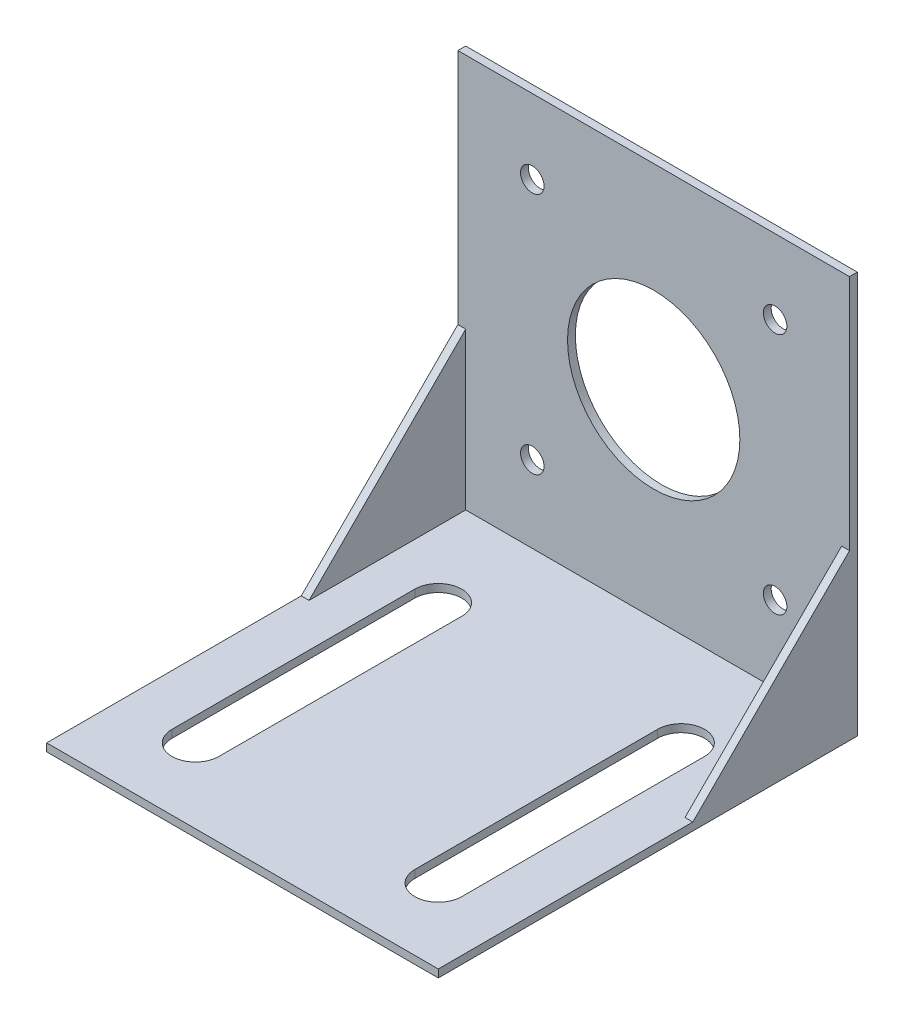
ISO-10303-21;
HEADER;
FILE_DESCRIPTION(('STEP AP214'),'2;1');
FILE_NAME('part.step','',(''),(''),'','','');
FILE_SCHEMA(('AUTOMOTIVE_DESIGN { 1 0 10303 214 1 1 1 1 }'));
ENDSEC;
DATA;
#1=APPLICATION_CONTEXT('core data for automotive mechanical design processes');
#2=APPLICATION_PROTOCOL_DEFINITION('international standard','automotive_design',2000,#1);
#3=PRODUCT_CONTEXT('',#1,'mechanical');
#4=PRODUCT('Part','Part','',(#3));
#5=PRODUCT_RELATED_PRODUCT_CATEGORY('part','',(#4));
#6=PRODUCT_DEFINITION_FORMATION('','',#4);
#7=PRODUCT_DEFINITION_CONTEXT('part definition',#1,'design');
#8=PRODUCT_DEFINITION('design','',#6,#7);
#9=PRODUCT_DEFINITION_SHAPE('','',#8);
#10=(LENGTH_UNIT() NAMED_UNIT(*) SI_UNIT(.MILLI.,.METRE.));
#11=(NAMED_UNIT(*) PLANE_ANGLE_UNIT() SI_UNIT($,.RADIAN.));
#12=(NAMED_UNIT(*) SI_UNIT($,.STERADIAN.) SOLID_ANGLE_UNIT());
#13=UNCERTAINTY_MEASURE_WITH_UNIT(LENGTH_MEASURE(1.E-05),#10,'distance_accuracy_value','');
#14=(GEOMETRIC_REPRESENTATION_CONTEXT(3) GLOBAL_UNCERTAINTY_ASSIGNED_CONTEXT((#13)) GLOBAL_UNIT_ASSIGNED_CONTEXT((#10,
#11,#12)) REPRESENTATION_CONTEXT('',''));
#15=CARTESIAN_POINT('',(0.,0.,0.));
#16=DIRECTION('',(0.,0.,1.));
#17=DIRECTION('',(1.,0.,0.));
#18=AXIS2_PLACEMENT_3D('',#15,#16,#17);
#19=CARTESIAN_POINT('',(0.,1.,0.));
#20=DIRECTION('',(0.,1.,0.));
#21=DIRECTION('',(0.,0.,1.));
#22=AXIS2_PLACEMENT_3D('',#19,#20,#21);
#23=PLANE('',#22);
#24=DIRECTION('',(0.,0.,1.));
#25=VECTOR('',#24,1.);
#26=CARTESIAN_POINT('',(-18.5,1.,-13.75));
#27=LINE('',#26,#25);
#28=CARTESIAN_POINT('',(-18.5,1.,-13.75));
#29=VERTEX_POINT('',#28);
#30=CARTESIAN_POINT('',(-18.5,1.,17.25));
#31=VERTEX_POINT('',#30);
#32=EDGE_CURVE('E226',#29,#31,#27,.T.);
#33=ORIENTED_EDGE('',*,*,#32,.F.);
#34=CARTESIAN_POINT('',(-15.5,1.,-13.75));
#35=DIRECTION('',(0.,1.,0.));
#36=DIRECTION('',(0.,0.,-1.));
#37=AXIS2_PLACEMENT_3D('',#34,#35,#36);
#38=CIRCLE('',#37,3.);
#39=CARTESIAN_POINT('',(-12.5,1.,-13.75));
#40=VERTEX_POINT('',#39);
#41=EDGE_CURVE('E224',#40,#29,#38,.T.);
#42=ORIENTED_EDGE('',*,*,#41,.F.);
#43=DIRECTION('',(0.,0.,-1.));
#44=VECTOR('',#43,1.);
#45=CARTESIAN_POINT('',(-12.5,1.,-13.75));
#46=LINE('',#45,#44);
#47=CARTESIAN_POINT('',(-12.5,1.,17.25));
#48=VERTEX_POINT('',#47);
#49=EDGE_CURVE('E232',#48,#40,#46,.T.);
#50=ORIENTED_EDGE('',*,*,#49,.F.);
#51=CARTESIAN_POINT('',(-15.5,1.,17.25));
#52=DIRECTION('',(0.,1.,0.));
#53=DIRECTION('',(0.,0.,1.));
#54=AXIS2_PLACEMENT_3D('',#51,#52,#53);
#55=CIRCLE('',#54,3.);
#56=EDGE_CURVE('E229',#31,#48,#55,.T.);
#57=ORIENTED_EDGE('',*,*,#56,.F.);
#58=EDGE_LOOP('',(#33,#42,#50,#57));
#59=FACE_BOUND('',#58,.T.);
#60=DIRECTION('',(0.,0.,-1.));
#61=VECTOR('',#60,1.);
#62=CARTESIAN_POINT('',(18.5,1.,-13.75));
#63=LINE('',#62,#61);
#64=CARTESIAN_POINT('',(18.5,1.,17.25));
#65=VERTEX_POINT('',#64);
#66=CARTESIAN_POINT('',(18.5,1.,-13.75));
#67=VERTEX_POINT('',#66);
#68=EDGE_CURVE('E195',#65,#67,#63,.T.);
#69=ORIENTED_EDGE('',*,*,#68,.F.);
#70=CARTESIAN_POINT('',(15.5,1.,17.25));
#71=DIRECTION('',(0.,1.,0.));
#72=DIRECTION('',(0.,0.,-1.));
#73=AXIS2_PLACEMENT_3D('',#70,#71,#72);
#74=CIRCLE('',#73,3.);
#75=CARTESIAN_POINT('',(12.5,1.,17.25));
#76=VERTEX_POINT('',#75);
#77=EDGE_CURVE('E193',#76,#65,#74,.T.);
#78=ORIENTED_EDGE('',*,*,#77,.F.);
#79=DIRECTION('',(0.,0.,1.));
#80=VECTOR('',#79,1.);
#81=CARTESIAN_POINT('',(12.5,1.,-13.75));
#82=LINE('',#81,#80);
#83=CARTESIAN_POINT('',(12.5,1.,-13.75));
#84=VERTEX_POINT('',#83);
#85=EDGE_CURVE('E201',#84,#76,#82,.T.);
#86=ORIENTED_EDGE('',*,*,#85,.F.);
#87=CARTESIAN_POINT('',(15.5,1.,-13.75));
#88=DIRECTION('',(0.,1.,0.));
#89=DIRECTION('',(0.,0.,1.));
#90=AXIS2_PLACEMENT_3D('',#87,#88,#89);
#91=CIRCLE('',#90,3.);
#92=EDGE_CURVE('E198',#67,#84,#91,.T.);
#93=ORIENTED_EDGE('',*,*,#92,.F.);
#94=EDGE_LOOP('',(#69,#78,#86,#93));
#95=FACE_BOUND('',#94,.T.);
#96=DIRECTION('',(0.,0.,-1.));
#97=VECTOR('',#96,1.);
#98=CARTESIAN_POINT('',(25.,1.,-26.75));
#99=LINE('',#98,#97);
#100=CARTESIAN_POINT('',(25.,1.,26.75));
#101=VERTEX_POINT('',#100);
#102=CARTESIAN_POINT('',(25.,1.,-5.75000000000001));
#103=VERTEX_POINT('',#102);
#104=EDGE_CURVE('E255',#101,#103,#99,.T.);
#105=ORIENTED_EDGE('',*,*,#104,.T.);
#106=DIRECTION('',(1.,0.,0.));
#107=VECTOR('',#106,1.);
#108=CARTESIAN_POINT('',(24.,1.,-5.75));
#109=LINE('',#108,#107);
#110=CARTESIAN_POINT('',(24.,1.,-5.75));
#111=VERTEX_POINT('',#110);
#112=EDGE_CURVE('E51',#111,#103,#109,.T.);
#113=ORIENTED_EDGE('',*,*,#112,.F.);
#114=DIRECTION('',(0.,0.,1.));
#115=VECTOR('',#114,1.);
#116=CARTESIAN_POINT('',(24.,1.,-5.75));
#117=LINE('',#116,#115);
#118=CARTESIAN_POINT('',(24.,1.,-25.75));
#119=VERTEX_POINT('',#118);
#120=EDGE_CURVE('E349',#119,#111,#117,.T.);
#121=ORIENTED_EDGE('',*,*,#120,.F.);
#122=DIRECTION('',(-1.,0.,0.));
#123=VECTOR('',#122,1.);
#124=CARTESIAN_POINT('',(0.,1.,-25.75));
#125=LINE('',#124,#123);
#126=CARTESIAN_POINT('',(-24.,1.,-25.75));
#127=VERTEX_POINT('',#126);
#128=EDGE_CURVE('E178',#119,#127,#125,.T.);
#129=ORIENTED_EDGE('',*,*,#128,.T.);
#130=DIRECTION('',(0.,0.,-1.));
#131=VECTOR('',#130,1.);
#132=CARTESIAN_POINT('',(-24.,1.,-5.75));
#133=LINE('',#132,#131);
#134=CARTESIAN_POINT('',(-24.,1.,-5.75));
#135=VERTEX_POINT('',#134);
#136=EDGE_CURVE('E309',#135,#127,#133,.T.);
#137=ORIENTED_EDGE('',*,*,#136,.F.);
#138=DIRECTION('',(-1.,0.,0.));
#139=VECTOR('',#138,1.);
#140=CARTESIAN_POINT('',(-24.,1.,-5.75));
#141=LINE('',#140,#139);
#142=CARTESIAN_POINT('',(-25.,1.,-5.75));
#143=VERTEX_POINT('',#142);
#144=EDGE_CURVE('E311',#135,#143,#141,.T.);
#145=ORIENTED_EDGE('',*,*,#144,.T.);
#146=DIRECTION('',(0.,0.,1.));
#147=VECTOR('',#146,1.);
#148=CARTESIAN_POINT('',(-25.,1.,-26.75));
#149=LINE('',#148,#147);
#150=CARTESIAN_POINT('',(-25.,1.,26.75));
#151=VERTEX_POINT('',#150);
#152=EDGE_CURVE('E257',#143,#151,#149,.T.);
#153=ORIENTED_EDGE('',*,*,#152,.T.);
#154=DIRECTION('',(1.,0.,0.));
#155=VECTOR('',#154,1.);
#156=CARTESIAN_POINT('',(-25.,1.,26.75));
#157=LINE('',#156,#155);
#158=EDGE_CURVE('E260',#151,#101,#157,.T.);
#159=ORIENTED_EDGE('',*,*,#158,.T.);
#160=EDGE_LOOP('',(#105,#113,#121,#129,#137,#145,#153,#159));
#161=FACE_BOUND('',#160,.T.);
#162=ADVANCED_FACE('F36',(#59,#95,#161),#23,.T.);
#163=CARTESIAN_POINT('',(0.,0.,-25.75));
#164=DIRECTION('',(0.,0.,-1.));
#165=DIRECTION('',(-1.,0.,0.));
#166=AXIS2_PLACEMENT_3D('',#163,#164,#165);
#167=PLANE('',#166);
#168=CARTESIAN_POINT('',(0.,26.3,-25.75));
#169=DIRECTION('',(0.,0.,1.));
#170=DIRECTION('',(1.,0.,0.));
#171=AXIS2_PLACEMENT_3D('',#168,#169,#170);
#172=CIRCLE('',#171,11.);
#173=CARTESIAN_POINT('',(11.,26.3,-25.75));
#174=VERTEX_POINT('',#173);
#175=EDGE_CURVE('E354',#174,#174,#172,.T.);
#176=ORIENTED_EDGE('',*,*,#175,.F.);
#177=EDGE_LOOP('',(#176));
#178=FACE_BOUND('',#177,.T.);
#179=CARTESIAN_POINT('',(-15.5,41.8,-25.75));
#180=DIRECTION('',(0.,0.,1.));
#181=DIRECTION('',(1.,0.,0.));
#182=AXIS2_PLACEMENT_3D('',#179,#180,#181);
#183=CIRCLE('',#182,1.5);
#184=CARTESIAN_POINT('',(-14.,41.8,-25.75));
#185=VERTEX_POINT('',#184);
#186=EDGE_CURVE('E189',#185,#185,#183,.T.);
#187=ORIENTED_EDGE('',*,*,#186,.F.);
#188=EDGE_LOOP('',(#187));
#189=FACE_BOUND('',#188,.T.);
#190=CARTESIAN_POINT('',(15.5,41.8,-25.75));
#191=DIRECTION('',(0.,0.,1.));
#192=DIRECTION('',(1.,0.,0.));
#193=AXIS2_PLACEMENT_3D('',#190,#191,#192);
#194=CIRCLE('',#193,1.5);
#195=CARTESIAN_POINT('',(17.,41.8,-25.75));
#196=VERTEX_POINT('',#195);
#197=EDGE_CURVE('E330',#196,#196,#194,.T.);
#198=ORIENTED_EDGE('',*,*,#197,.F.);
#199=EDGE_LOOP('',(#198));
#200=FACE_BOUND('',#199,.T.);
#201=CARTESIAN_POINT('',(-15.5,10.8,-25.75));
#202=DIRECTION('',(0.,0.,1.));
#203=DIRECTION('',(1.,0.,0.));
#204=AXIS2_PLACEMENT_3D('',#201,#202,#203);
#205=CIRCLE('',#204,1.5);
#206=CARTESIAN_POINT('',(-14.,10.8,-25.75));
#207=VERTEX_POINT('',#206);
#208=EDGE_CURVE('E324',#207,#207,#205,.T.);
#209=ORIENTED_EDGE('',*,*,#208,.F.);
#210=EDGE_LOOP('',(#209));
#211=FACE_BOUND('',#210,.T.);
#212=CARTESIAN_POINT('',(15.5,10.8,-25.75));
#213=DIRECTION('',(0.,0.,1.));
#214=DIRECTION('',(1.,0.,0.));
#215=AXIS2_PLACEMENT_3D('',#212,#213,#214);
#216=CIRCLE('',#215,1.5);
#217=CARTESIAN_POINT('',(17.,10.8,-25.75));
#218=VERTEX_POINT('',#217);
#219=EDGE_CURVE('E318',#218,#218,#216,.T.);
#220=ORIENTED_EDGE('',*,*,#219,.F.);
#221=EDGE_LOOP('',(#220));
#222=FACE_BOUND('',#221,.T.);
#223=DIRECTION('',(1.,0.,0.));
#224=VECTOR('',#223,1.);
#225=CARTESIAN_POINT('',(24.,21.,-25.75));
#226=LINE('',#225,#224);
#227=CARTESIAN_POINT('',(24.,21.,-25.75));
#228=VERTEX_POINT('',#227);
#229=CARTESIAN_POINT('',(25.,21.,-25.75));
#230=VERTEX_POINT('',#229);
#231=EDGE_CURVE('E167',#228,#230,#226,.T.);
#232=ORIENTED_EDGE('',*,*,#231,.T.);
#233=DIRECTION('',(0.,1.,0.));
#234=VECTOR('',#233,1.);
#235=CARTESIAN_POINT('',(25.,0.,-25.75));
#236=LINE('',#235,#234);
#237=CARTESIAN_POINT('',(25.,51.3,-25.75));
#238=VERTEX_POINT('',#237);
#239=EDGE_CURVE('E160',#230,#238,#236,.T.);
#240=ORIENTED_EDGE('',*,*,#239,.T.);
#241=DIRECTION('',(-1.,0.,0.));
#242=VECTOR('',#241,1.);
#243=CARTESIAN_POINT('',(-25.,51.3,-25.75));
#244=LINE('',#243,#242);
#245=CARTESIAN_POINT('',(-25.,51.3,-25.75));
#246=VERTEX_POINT('',#245);
#247=EDGE_CURVE('E164',#238,#246,#244,.T.);
#248=ORIENTED_EDGE('',*,*,#247,.T.);
#249=DIRECTION('',(0.,-1.,0.));
#250=VECTOR('',#249,1.);
#251=CARTESIAN_POINT('',(-25.,0.,-25.75));
#252=LINE('',#251,#250);
#253=CARTESIAN_POINT('',(-25.,21.,-25.75));
#254=VERTEX_POINT('',#253);
#255=EDGE_CURVE('E171',#246,#254,#252,.T.);
#256=ORIENTED_EDGE('',*,*,#255,.T.);
#257=DIRECTION('',(-1.,0.,0.));
#258=VECTOR('',#257,1.);
#259=CARTESIAN_POINT('',(-24.,21.,-25.75));
#260=LINE('',#259,#258);
#261=CARTESIAN_POINT('',(-24.,21.,-25.75));
#262=VERTEX_POINT('',#261);
#263=EDGE_CURVE('E314',#262,#254,#260,.T.);
#264=ORIENTED_EDGE('',*,*,#263,.F.);
#265=DIRECTION('',(0.,1.,0.));
#266=VECTOR('',#265,1.);
#267=CARTESIAN_POINT('',(-24.,1.,-25.75));
#268=LINE('',#267,#266);
#269=EDGE_CURVE('E299',#127,#262,#268,.T.);
#270=ORIENTED_EDGE('',*,*,#269,.F.);
#271=ORIENTED_EDGE('',*,*,#128,.F.);
#272=DIRECTION('',(0.,-1.,0.));
#273=VECTOR('',#272,1.);
#274=CARTESIAN_POINT('',(24.,1.,-25.75));
#275=LINE('',#274,#273);
#276=EDGE_CURVE('E59',#228,#119,#275,.T.);
#277=ORIENTED_EDGE('',*,*,#276,.F.);
#278=EDGE_LOOP('',(#232,#240,#248,#256,#264,#270,#271,#277));
#279=FACE_BOUND('',#278,.T.);
#280=ADVANCED_FACE('F162',(#178,#189,#200,#211,#222,#279),#167,.F.);
#281=CARTESIAN_POINT('',(0.,0.,0.));
#282=DIRECTION('',(0.,1.,0.));
#283=DIRECTION('',(0.,0.,1.));
#284=AXIS2_PLACEMENT_3D('',#281,#282,#283);
#285=PLANE('',#284);
#286=DIRECTION('',(-1.,0.,0.));
#287=VECTOR('',#286,1.);
#288=CARTESIAN_POINT('',(-25.,0.,-26.75));
#289=LINE('',#288,#287);
#290=CARTESIAN_POINT('',(25.,0.,-26.75));
#291=VERTEX_POINT('',#290);
#292=CARTESIAN_POINT('',(-25.,0.,-26.75));
#293=VERTEX_POINT('',#292);
#294=EDGE_CURVE('E264',#291,#293,#289,.T.);
#295=ORIENTED_EDGE('',*,*,#294,.F.);
#296=DIRECTION('',(0.,0.,-1.));
#297=VECTOR('',#296,1.);
#298=CARTESIAN_POINT('',(25.,0.,-26.75));
#299=LINE('',#298,#297);
#300=CARTESIAN_POINT('',(25.,0.,26.75));
#301=VERTEX_POINT('',#300);
#302=EDGE_CURVE('E254',#301,#291,#299,.T.);
#303=ORIENTED_EDGE('',*,*,#302,.F.);
#304=DIRECTION('',(1.,0.,0.));
#305=VECTOR('',#304,1.);
#306=CARTESIAN_POINT('',(-25.,0.,26.75));
#307=LINE('',#306,#305);
#308=CARTESIAN_POINT('',(-25.,0.,26.75));
#309=VERTEX_POINT('',#308);
#310=EDGE_CURVE('E258',#309,#301,#307,.T.);
#311=ORIENTED_EDGE('',*,*,#310,.F.);
#312=DIRECTION('',(0.,0.,1.));
#313=VECTOR('',#312,1.);
#314=CARTESIAN_POINT('',(-25.,0.,-26.75));
#315=LINE('',#314,#313);
#316=EDGE_CURVE('E266',#293,#309,#315,.T.);
#317=ORIENTED_EDGE('',*,*,#316,.F.);
#318=EDGE_LOOP('',(#295,#303,#311,#317));
#319=FACE_BOUND('',#318,.T.);
#320=CARTESIAN_POINT('',(15.5,0.,17.25));
#321=DIRECTION('',(0.,1.,0.));
#322=DIRECTION('',(0.,0.,-1.));
#323=AXIS2_PLACEMENT_3D('',#320,#321,#322);
#324=CIRCLE('',#323,3.);
#325=CARTESIAN_POINT('',(12.5,0.,17.25));
#326=VERTEX_POINT('',#325);
#327=CARTESIAN_POINT('',(18.5,0.,17.25));
#328=VERTEX_POINT('',#327);
#329=EDGE_CURVE('E192',#326,#328,#324,.T.);
#330=ORIENTED_EDGE('',*,*,#329,.T.);
#331=DIRECTION('',(0.,0.,-1.));
#332=VECTOR('',#331,1.);
#333=CARTESIAN_POINT('',(18.5,0.,-13.75));
#334=LINE('',#333,#332);
#335=CARTESIAN_POINT('',(18.5,0.,-13.75));
#336=VERTEX_POINT('',#335);
#337=EDGE_CURVE('E206',#328,#336,#334,.T.);
#338=ORIENTED_EDGE('',*,*,#337,.T.);
#339=CARTESIAN_POINT('',(15.5,0.,-13.75));
#340=DIRECTION('',(0.,1.,0.));
#341=DIRECTION('',(0.,0.,1.));
#342=AXIS2_PLACEMENT_3D('',#339,#340,#341);
#343=CIRCLE('',#342,3.);
#344=CARTESIAN_POINT('',(12.5,0.,-13.75));
#345=VERTEX_POINT('',#344);
#346=EDGE_CURVE('E209',#336,#345,#343,.T.);
#347=ORIENTED_EDGE('',*,*,#346,.T.);
#348=DIRECTION('',(0.,0.,1.));
#349=VECTOR('',#348,1.);
#350=CARTESIAN_POINT('',(12.5,0.,-13.75));
#351=LINE('',#350,#349);
#352=EDGE_CURVE('E196',#345,#326,#351,.T.);
#353=ORIENTED_EDGE('',*,*,#352,.T.);
#354=EDGE_LOOP('',(#330,#338,#347,#353));
#355=FACE_BOUND('',#354,.T.);
#356=CARTESIAN_POINT('',(-15.5,0.,-13.75));
#357=DIRECTION('',(0.,1.,0.));
#358=DIRECTION('',(0.,0.,-1.));
#359=AXIS2_PLACEMENT_3D('',#356,#357,#358);
#360=CIRCLE('',#359,3.);
#361=CARTESIAN_POINT('',(-12.5,0.,-13.75));
#362=VERTEX_POINT('',#361);
#363=CARTESIAN_POINT('',(-18.5,0.,-13.75));
#364=VERTEX_POINT('',#363);
#365=EDGE_CURVE('E223',#362,#364,#360,.T.);
#366=ORIENTED_EDGE('',*,*,#365,.T.);
#367=DIRECTION('',(0.,0.,1.));
#368=VECTOR('',#367,1.);
#369=CARTESIAN_POINT('',(-18.5,0.,-13.75));
#370=LINE('',#369,#368);
#371=CARTESIAN_POINT('',(-18.5,0.,17.25));
#372=VERTEX_POINT('',#371);
#373=EDGE_CURVE('E237',#364,#372,#370,.T.);
#374=ORIENTED_EDGE('',*,*,#373,.T.);
#375=CARTESIAN_POINT('',(-15.5,0.,17.25));
#376=DIRECTION('',(0.,1.,0.));
#377=DIRECTION('',(0.,0.,1.));
#378=AXIS2_PLACEMENT_3D('',#375,#376,#377);
#379=CIRCLE('',#378,3.);
#380=CARTESIAN_POINT('',(-12.5,0.,17.25));
#381=VERTEX_POINT('',#380);
#382=EDGE_CURVE('E240',#372,#381,#379,.T.);
#383=ORIENTED_EDGE('',*,*,#382,.T.);
#384=DIRECTION('',(0.,0.,-1.));
#385=VECTOR('',#384,1.);
#386=CARTESIAN_POINT('',(-12.5,0.,-13.75));
#387=LINE('',#386,#385);
#388=EDGE_CURVE('E227',#381,#362,#387,.T.);
#389=ORIENTED_EDGE('',*,*,#388,.T.);
#390=EDGE_LOOP('',(#366,#374,#383,#389));
#391=FACE_BOUND('',#390,.T.);
#392=ADVANCED_FACE('F283',(#319,#355,#391),#285,.F.);
#393=CARTESIAN_POINT('',(25.,1.,-26.75));
#394=DIRECTION('',(-1.,0.,0.));
#395=DIRECTION('',(0.,0.,1.));
#396=AXIS2_PLACEMENT_3D('',#393,#394,#395);
#397=PLANE('',#396);
#398=ORIENTED_EDGE('',*,*,#239,.F.);
#399=DIRECTION('',(0.,0.707106781186548,-0.707106781186548));
#400=VECTOR('',#399,1.);
#401=CARTESIAN_POINT('',(25.,21.,-25.75));
#402=LINE('',#401,#400);
#403=EDGE_CURVE('E291',#103,#230,#402,.T.);
#404=ORIENTED_EDGE('',*,*,#403,.F.);
#405=ORIENTED_EDGE('',*,*,#104,.F.);
#406=DIRECTION('',(0.,-1.,0.));
#407=VECTOR('',#406,1.);
#408=CARTESIAN_POINT('',(25.,1.,26.75));
#409=LINE('',#408,#407);
#410=EDGE_CURVE('E262',#101,#301,#409,.T.);
#411=ORIENTED_EDGE('',*,*,#410,.T.);
#412=ORIENTED_EDGE('',*,*,#302,.T.);
#413=DIRECTION('',(0.,-1.,0.));
#414=VECTOR('',#413,1.);
#415=CARTESIAN_POINT('',(25.,1.,-26.75));
#416=LINE('',#415,#414);
#417=CARTESIAN_POINT('',(25.,51.3,-26.75));
#418=VERTEX_POINT('',#417);
#419=EDGE_CURVE('E11',#418,#291,#416,.T.);
#420=ORIENTED_EDGE('',*,*,#419,.F.);
#421=DIRECTION('',(0.,0.,-1.));
#422=VECTOR('',#421,1.);
#423=CARTESIAN_POINT('',(25.,51.3,-25.75));
#424=LINE('',#423,#422);
#425=EDGE_CURVE('E174',#238,#418,#424,.T.);
#426=ORIENTED_EDGE('',*,*,#425,.F.);
#427=EDGE_LOOP('',(#398,#404,#405,#411,#412,#420,#426));
#428=FACE_BOUND('',#427,.T.);
#429=ADVANCED_FACE('F38',(#428),#397,.F.);
#430=CARTESIAN_POINT('',(-25.,1.,-26.75));
#431=DIRECTION('',(0.,0.,1.));
#432=DIRECTION('',(1.,0.,0.));
#433=AXIS2_PLACEMENT_3D('',#430,#431,#432);
#434=PLANE('',#433);
#435=CARTESIAN_POINT('',(0.,26.3,-26.75));
#436=DIRECTION('',(0.,0.,1.));
#437=DIRECTION('',(1.,0.,0.));
#438=AXIS2_PLACEMENT_3D('',#435,#436,#437);
#439=CIRCLE('',#438,11.);
#440=CARTESIAN_POINT('',(11.,26.3,-26.75));
#441=VERTEX_POINT('',#440);
#442=EDGE_CURVE('E352',#441,#441,#439,.T.);
#443=ORIENTED_EDGE('',*,*,#442,.T.);
#444=EDGE_LOOP('',(#443));
#445=FACE_BOUND('',#444,.T.);
#446=ORIENTED_EDGE('',*,*,#294,.T.);
#447=DIRECTION('',(0.,-1.,0.));
#448=VECTOR('',#447,1.);
#449=CARTESIAN_POINT('',(-25.,1.,-26.75));
#450=LINE('',#449,#448);
#451=CARTESIAN_POINT('',(-25.,51.3,-26.75));
#452=VERTEX_POINT('',#451);
#453=EDGE_CURVE('E44',#452,#293,#450,.T.);
#454=ORIENTED_EDGE('',*,*,#453,.F.);
#455=DIRECTION('',(-1.,0.,0.));
#456=VECTOR('',#455,1.);
#457=CARTESIAN_POINT('',(-25.,51.3,-26.75));
#458=LINE('',#457,#456);
#459=EDGE_CURVE('E188',#418,#452,#458,.T.);
#460=ORIENTED_EDGE('',*,*,#459,.F.);
#461=ORIENTED_EDGE('',*,*,#419,.T.);
#462=EDGE_LOOP('',(#446,#454,#460,#461));
#463=FACE_BOUND('',#462,.T.);
#464=CARTESIAN_POINT('',(-15.5,10.8,-26.75));
#465=DIRECTION('',(0.,0.,1.));
#466=DIRECTION('',(1.,0.,0.));
#467=AXIS2_PLACEMENT_3D('',#464,#465,#466);
#468=CIRCLE('',#467,1.5);
#469=CARTESIAN_POINT('',(-14.,10.8,-26.75));
#470=VERTEX_POINT('',#469);
#471=EDGE_CURVE('E321',#470,#470,#468,.T.);
#472=ORIENTED_EDGE('',*,*,#471,.T.);
#473=EDGE_LOOP('',(#472));
#474=FACE_BOUND('',#473,.T.);
#475=CARTESIAN_POINT('',(-15.5,41.8,-26.75));
#476=DIRECTION('',(0.,0.,1.));
#477=DIRECTION('',(1.,0.,0.));
#478=AXIS2_PLACEMENT_3D('',#475,#476,#477);
#479=CIRCLE('',#478,1.5);
#480=CARTESIAN_POINT('',(-14.,41.8,-26.75));
#481=VERTEX_POINT('',#480);
#482=EDGE_CURVE('E333',#481,#481,#479,.T.);
#483=ORIENTED_EDGE('',*,*,#482,.T.);
#484=EDGE_LOOP('',(#483));
#485=FACE_BOUND('',#484,.T.);
#486=CARTESIAN_POINT('',(15.5,41.8,-26.75));
#487=DIRECTION('',(0.,0.,1.));
#488=DIRECTION('',(1.,0.,0.));
#489=AXIS2_PLACEMENT_3D('',#486,#487,#488);
#490=CIRCLE('',#489,1.5);
#491=CARTESIAN_POINT('',(17.,41.8,-26.75));
#492=VERTEX_POINT('',#491);
#493=EDGE_CURVE('E327',#492,#492,#490,.T.);
#494=ORIENTED_EDGE('',*,*,#493,.T.);
#495=EDGE_LOOP('',(#494));
#496=FACE_BOUND('',#495,.T.);
#497=CARTESIAN_POINT('',(15.5,10.8,-26.75));
#498=DIRECTION('',(0.,0.,1.));
#499=DIRECTION('',(1.,0.,0.));
#500=AXIS2_PLACEMENT_3D('',#497,#498,#499);
#501=CIRCLE('',#500,1.5);
#502=CARTESIAN_POINT('',(17.,10.8,-26.75));
#503=VERTEX_POINT('',#502);
#504=EDGE_CURVE('E317',#503,#503,#501,.T.);
#505=ORIENTED_EDGE('',*,*,#504,.T.);
#506=EDGE_LOOP('',(#505));
#507=FACE_BOUND('',#506,.T.);
#508=ADVANCED_FACE('F361',(#445,#463,#474,#485,#496,#507),#434,.F.);
#509=CARTESIAN_POINT('',(-25.,1.,-26.75));
#510=DIRECTION('',(1.,0.,0.));
#511=DIRECTION('',(0.,0.,-1.));
#512=AXIS2_PLACEMENT_3D('',#509,#510,#511);
#513=PLANE('',#512);
#514=ORIENTED_EDGE('',*,*,#152,.F.);
#515=DIRECTION('',(0.,-0.707106781186548,0.707106781186548));
#516=VECTOR('',#515,1.);
#517=CARTESIAN_POINT('',(-25.,21.,-25.75));
#518=LINE('',#517,#516);
#519=EDGE_CURVE('E296',#254,#143,#518,.T.);
#520=ORIENTED_EDGE('',*,*,#519,.F.);
#521=ORIENTED_EDGE('',*,*,#255,.F.);
#522=DIRECTION('',(0.,0.,-1.));
#523=VECTOR('',#522,1.);
#524=CARTESIAN_POINT('',(-25.,51.3,-25.75));
#525=LINE('',#524,#523);
#526=EDGE_CURVE('E179',#246,#452,#525,.T.);
#527=ORIENTED_EDGE('',*,*,#526,.T.);
#528=ORIENTED_EDGE('',*,*,#453,.T.);
#529=ORIENTED_EDGE('',*,*,#316,.T.);
#530=DIRECTION('',(0.,-1.,0.));
#531=VECTOR('',#530,1.);
#532=CARTESIAN_POINT('',(-25.,1.,26.75));
#533=LINE('',#532,#531);
#534=EDGE_CURVE('E271',#151,#309,#533,.T.);
#535=ORIENTED_EDGE('',*,*,#534,.F.);
#536=EDGE_LOOP('',(#514,#520,#521,#527,#528,#529,#535));
#537=FACE_BOUND('',#536,.T.);
#538=ADVANCED_FACE('F277',(#537),#513,.F.);
#539=CARTESIAN_POINT('',(-25.,1.,26.75));
#540=DIRECTION('',(0.,0.,-1.));
#541=DIRECTION('',(-1.,0.,0.));
#542=AXIS2_PLACEMENT_3D('',#539,#540,#541);
#543=PLANE('',#542);
#544=ORIENTED_EDGE('',*,*,#310,.T.);
#545=ORIENTED_EDGE('',*,*,#410,.F.);
#546=ORIENTED_EDGE('',*,*,#158,.F.);
#547=ORIENTED_EDGE('',*,*,#534,.T.);
#548=EDGE_LOOP('',(#544,#545,#546,#547));
#549=FACE_BOUND('',#548,.T.);
#550=ADVANCED_FACE('F288',(#549),#543,.F.);
#551=CARTESIAN_POINT('',(-15.5,1.,-13.75));
#552=DIRECTION('',(0.,-1.,0.));
#553=DIRECTION('',(0.,0.,-1.));
#554=AXIS2_PLACEMENT_3D('',#551,#552,#553);
#555=CYLINDRICAL_SURFACE('',#554,3.);
#556=ORIENTED_EDGE('',*,*,#365,.F.);
#557=DIRECTION('',(0.,-1.,0.));
#558=VECTOR('',#557,1.);
#559=CARTESIAN_POINT('',(-12.5,1.,-13.75));
#560=LINE('',#559,#558);
#561=EDGE_CURVE('E234',#40,#362,#560,.T.);
#562=ORIENTED_EDGE('',*,*,#561,.F.);
#563=ORIENTED_EDGE('',*,*,#41,.T.);
#564=DIRECTION('',(0.,-1.,0.));
#565=VECTOR('',#564,1.);
#566=CARTESIAN_POINT('',(-18.5,1.,-13.75));
#567=LINE('',#566,#565);
#568=EDGE_CURVE('E251',#29,#364,#567,.T.);
#569=ORIENTED_EDGE('',*,*,#568,.T.);
#570=EDGE_LOOP('',(#556,#562,#563,#569));
#571=FACE_BOUND('',#570,.T.);
#572=ADVANCED_FACE('F402',(#571),#555,.F.);
#573=CARTESIAN_POINT('',(-18.5,1.,-13.75));
#574=DIRECTION('',(1.,0.,0.));
#575=DIRECTION('',(0.,0.,-1.));
#576=AXIS2_PLACEMENT_3D('',#573,#574,#575);
#577=PLANE('',#576);
#578=ORIENTED_EDGE('',*,*,#373,.F.);
#579=ORIENTED_EDGE('',*,*,#568,.F.);
#580=ORIENTED_EDGE('',*,*,#32,.T.);
#581=DIRECTION('',(0.,-1.,0.));
#582=VECTOR('',#581,1.);
#583=CARTESIAN_POINT('',(-18.5,1.,17.25));
#584=LINE('',#583,#582);
#585=EDGE_CURVE('E249',#31,#372,#584,.T.);
#586=ORIENTED_EDGE('',*,*,#585,.T.);
#587=EDGE_LOOP('',(#578,#579,#580,#586));
#588=FACE_BOUND('',#587,.T.);
#589=ADVANCED_FACE('F410',(#588),#577,.T.);
#590=CARTESIAN_POINT('',(-15.5,1.,17.25));
#591=DIRECTION('',(0.,-1.,0.));
#592=DIRECTION('',(0.,0.,-1.));
#593=AXIS2_PLACEMENT_3D('',#590,#591,#592);
#594=CYLINDRICAL_SURFACE('',#593,3.);
#595=ORIENTED_EDGE('',*,*,#382,.F.);
#596=ORIENTED_EDGE('',*,*,#585,.F.);
#597=ORIENTED_EDGE('',*,*,#56,.T.);
#598=DIRECTION('',(0.,-1.,0.));
#599=VECTOR('',#598,1.);
#600=CARTESIAN_POINT('',(-12.5,1.,17.25));
#601=LINE('',#600,#599);
#602=EDGE_CURVE('E247',#48,#381,#601,.T.);
#603=ORIENTED_EDGE('',*,*,#602,.T.);
#604=EDGE_LOOP('',(#595,#596,#597,#603));
#605=FACE_BOUND('',#604,.T.);
#606=ADVANCED_FACE('F415',(#605),#594,.F.);
#607=CARTESIAN_POINT('',(-12.5,1.,-13.75));
#608=DIRECTION('',(-1.,0.,0.));
#609=DIRECTION('',(0.,0.,1.));
#610=AXIS2_PLACEMENT_3D('',#607,#608,#609);
#611=PLANE('',#610);
#612=ORIENTED_EDGE('',*,*,#388,.F.);
#613=ORIENTED_EDGE('',*,*,#602,.F.);
#614=ORIENTED_EDGE('',*,*,#49,.T.);
#615=ORIENTED_EDGE('',*,*,#561,.T.);
#616=EDGE_LOOP('',(#612,#613,#614,#615));
#617=FACE_BOUND('',#616,.T.);
#618=ADVANCED_FACE('F423',(#617),#611,.T.);
#619=CARTESIAN_POINT('',(15.5,1.,17.25));
#620=DIRECTION('',(0.,-1.,0.));
#621=DIRECTION('',(0.,0.,-1.));
#622=AXIS2_PLACEMENT_3D('',#619,#620,#621);
#623=CYLINDRICAL_SURFACE('',#622,3.);
#624=ORIENTED_EDGE('',*,*,#329,.F.);
#625=DIRECTION('',(0.,-1.,0.));
#626=VECTOR('',#625,1.);
#627=CARTESIAN_POINT('',(12.5,1.,17.25));
#628=LINE('',#627,#626);
#629=EDGE_CURVE('E203',#76,#326,#628,.T.);
#630=ORIENTED_EDGE('',*,*,#629,.F.);
#631=ORIENTED_EDGE('',*,*,#77,.T.);
#632=DIRECTION('',(0.,-1.,0.));
#633=VECTOR('',#632,1.);
#634=CARTESIAN_POINT('',(18.5,1.,17.25));
#635=LINE('',#634,#633);
#636=EDGE_CURVE('E220',#65,#328,#635,.T.);
#637=ORIENTED_EDGE('',*,*,#636,.T.);
#638=EDGE_LOOP('',(#624,#630,#631,#637));
#639=FACE_BOUND('',#638,.T.);
#640=ADVANCED_FACE('F434',(#639),#623,.F.);
#641=CARTESIAN_POINT('',(18.5,1.,-13.75));
#642=DIRECTION('',(-1.,0.,0.));
#643=DIRECTION('',(0.,0.,1.));
#644=AXIS2_PLACEMENT_3D('',#641,#642,#643);
#645=PLANE('',#644);
#646=ORIENTED_EDGE('',*,*,#337,.F.);
#647=ORIENTED_EDGE('',*,*,#636,.F.);
#648=ORIENTED_EDGE('',*,*,#68,.T.);
#649=DIRECTION('',(0.,-1.,0.));
#650=VECTOR('',#649,1.);
#651=CARTESIAN_POINT('',(18.5,1.,-13.75));
#652=LINE('',#651,#650);
#653=EDGE_CURVE('E218',#67,#336,#652,.T.);
#654=ORIENTED_EDGE('',*,*,#653,.T.);
#655=EDGE_LOOP('',(#646,#647,#648,#654));
#656=FACE_BOUND('',#655,.T.);
#657=ADVANCED_FACE('F439',(#656),#645,.T.);
#658=CARTESIAN_POINT('',(15.5,1.,-13.75));
#659=DIRECTION('',(0.,-1.,0.));
#660=DIRECTION('',(0.,0.,-1.));
#661=AXIS2_PLACEMENT_3D('',#658,#659,#660);
#662=CYLINDRICAL_SURFACE('',#661,3.);
#663=ORIENTED_EDGE('',*,*,#346,.F.);
#664=ORIENTED_EDGE('',*,*,#653,.F.);
#665=ORIENTED_EDGE('',*,*,#92,.T.);
#666=DIRECTION('',(0.,-1.,0.));
#667=VECTOR('',#666,1.);
#668=CARTESIAN_POINT('',(12.5,1.,-13.75));
#669=LINE('',#668,#667);
#670=EDGE_CURVE('E216',#84,#345,#669,.T.);
#671=ORIENTED_EDGE('',*,*,#670,.T.);
#672=EDGE_LOOP('',(#663,#664,#665,#671));
#673=FACE_BOUND('',#672,.T.);
#674=ADVANCED_FACE('F443',(#673),#662,.F.);
#675=CARTESIAN_POINT('',(12.5,1.,-13.75));
#676=DIRECTION('',(1.,0.,0.));
#677=DIRECTION('',(0.,0.,-1.));
#678=AXIS2_PLACEMENT_3D('',#675,#676,#677);
#679=PLANE('',#678);
#680=ORIENTED_EDGE('',*,*,#352,.F.);
#681=ORIENTED_EDGE('',*,*,#670,.F.);
#682=ORIENTED_EDGE('',*,*,#85,.T.);
#683=ORIENTED_EDGE('',*,*,#629,.T.);
#684=EDGE_LOOP('',(#680,#681,#682,#683));
#685=FACE_BOUND('',#684,.T.);
#686=ADVANCED_FACE('F447',(#685),#679,.T.);
#687=CARTESIAN_POINT('',(-25.,51.3,-25.75));
#688=DIRECTION('',(0.,-1.,0.));
#689=DIRECTION('',(1.,0.,0.));
#690=AXIS2_PLACEMENT_3D('',#687,#688,#689);
#691=PLANE('',#690);
#692=ORIENTED_EDGE('',*,*,#459,.T.);
#693=ORIENTED_EDGE('',*,*,#526,.F.);
#694=ORIENTED_EDGE('',*,*,#247,.F.);
#695=ORIENTED_EDGE('',*,*,#425,.T.);
#696=EDGE_LOOP('',(#692,#693,#694,#695));
#697=FACE_BOUND('',#696,.T.);
#698=ADVANCED_FACE('F181',(#697),#691,.F.);
#699=CARTESIAN_POINT('',(-15.5,41.8,-25.75));
#700=DIRECTION('',(0.,0.,-1.));
#701=DIRECTION('',(-1.,0.,0.));
#702=AXIS2_PLACEMENT_3D('',#699,#700,#701);
#703=CYLINDRICAL_SURFACE('',#702,1.5);
#704=ORIENTED_EDGE('',*,*,#186,.T.);
#705=EDGE_LOOP('',(#704));
#706=FACE_BOUND('',#705,.T.);
#707=ORIENTED_EDGE('',*,*,#482,.F.);
#708=EDGE_LOOP('',(#707));
#709=FACE_BOUND('',#708,.T.);
#710=ADVANCED_FACE('F453',(#706,#709),#703,.F.);
#711=CARTESIAN_POINT('',(15.5,41.8,-25.75));
#712=DIRECTION('',(0.,0.,-1.));
#713=DIRECTION('',(-1.,0.,0.));
#714=AXIS2_PLACEMENT_3D('',#711,#712,#713);
#715=CYLINDRICAL_SURFACE('',#714,1.5);
#716=ORIENTED_EDGE('',*,*,#197,.T.);
#717=EDGE_LOOP('',(#716));
#718=FACE_BOUND('',#717,.T.);
#719=ORIENTED_EDGE('',*,*,#493,.F.);
#720=EDGE_LOOP('',(#719));
#721=FACE_BOUND('',#720,.T.);
#722=ADVANCED_FACE('F457',(#718,#721),#715,.F.);
#723=CARTESIAN_POINT('',(-15.5,10.8,-25.75));
#724=DIRECTION('',(0.,0.,-1.));
#725=DIRECTION('',(-1.,0.,0.));
#726=AXIS2_PLACEMENT_3D('',#723,#724,#725);
#727=CYLINDRICAL_SURFACE('',#726,1.5);
#728=ORIENTED_EDGE('',*,*,#208,.T.);
#729=EDGE_LOOP('',(#728));
#730=FACE_BOUND('',#729,.T.);
#731=ORIENTED_EDGE('',*,*,#471,.F.);
#732=EDGE_LOOP('',(#731));
#733=FACE_BOUND('',#732,.T.);
#734=ADVANCED_FACE('F383',(#730,#733),#727,.F.);
#735=CARTESIAN_POINT('',(15.5,10.8,-25.75));
#736=DIRECTION('',(0.,0.,-1.));
#737=DIRECTION('',(-1.,0.,0.));
#738=AXIS2_PLACEMENT_3D('',#735,#736,#737);
#739=CYLINDRICAL_SURFACE('',#738,1.5);
#740=ORIENTED_EDGE('',*,*,#219,.T.);
#741=EDGE_LOOP('',(#740));
#742=FACE_BOUND('',#741,.T.);
#743=ORIENTED_EDGE('',*,*,#504,.F.);
#744=EDGE_LOOP('',(#743));
#745=FACE_BOUND('',#744,.T.);
#746=ADVANCED_FACE('F380',(#742,#745),#739,.F.);
#747=CARTESIAN_POINT('',(-24.,21.,-25.75));
#748=DIRECTION('',(0.,-0.707106781186547,-0.707106781186547));
#749=DIRECTION('',(0.,0.707106781186548,-0.707106781186548));
#750=AXIS2_PLACEMENT_3D('',#747,#748,#749);
#751=PLANE('',#750);
#752=ORIENTED_EDGE('',*,*,#519,.T.);
#753=ORIENTED_EDGE('',*,*,#144,.F.);
#754=DIRECTION('',(0.,-0.707106781186548,0.707106781186548));
#755=VECTOR('',#754,1.);
#756=CARTESIAN_POINT('',(-24.,21.,-25.75));
#757=LINE('',#756,#755);
#758=EDGE_CURVE('E306',#262,#135,#757,.T.);
#759=ORIENTED_EDGE('',*,*,#758,.F.);
#760=ORIENTED_EDGE('',*,*,#263,.T.);
#761=EDGE_LOOP('',(#752,#753,#759,#760));
#762=FACE_BOUND('',#761,.T.);
#763=ADVANCED_FACE('F344',(#762),#751,.F.);
#764=CARTESIAN_POINT('',(-24.,0.,0.));
#765=DIRECTION('',(-1.,0.,0.));
#766=DIRECTION('',(0.,0.,1.));
#767=AXIS2_PLACEMENT_3D('',#764,#765,#766);
#768=PLANE('',#767);
#769=ORIENTED_EDGE('',*,*,#269,.T.);
#770=ORIENTED_EDGE('',*,*,#758,.T.);
#771=ORIENTED_EDGE('',*,*,#136,.T.);
#772=EDGE_LOOP('',(#769,#770,#771));
#773=FACE_BOUND('',#772,.T.);
#774=ADVANCED_FACE('F346',(#773),#768,.F.);
#775=CARTESIAN_POINT('',(24.,21.,-25.75));
#776=DIRECTION('',(0.,-0.707106781186547,-0.707106781186547));
#777=DIRECTION('',(0.,0.707106781186548,-0.707106781186548));
#778=AXIS2_PLACEMENT_3D('',#775,#776,#777);
#779=PLANE('',#778);
#780=ORIENTED_EDGE('',*,*,#403,.T.);
#781=ORIENTED_EDGE('',*,*,#231,.F.);
#782=DIRECTION('',(0.,0.707106781186548,-0.707106781186548));
#783=VECTOR('',#782,1.);
#784=CARTESIAN_POINT('',(24.,21.,-25.75));
#785=LINE('',#784,#783);
#786=EDGE_CURVE('E295',#111,#228,#785,.T.);
#787=ORIENTED_EDGE('',*,*,#786,.F.);
#788=ORIENTED_EDGE('',*,*,#112,.T.);
#789=EDGE_LOOP('',(#780,#781,#787,#788));
#790=FACE_BOUND('',#789,.T.);
#791=ADVANCED_FACE('F294',(#790),#779,.F.);
#792=CARTESIAN_POINT('',(24.,0.,0.));
#793=DIRECTION('',(-1.,0.,0.));
#794=DIRECTION('',(0.,0.,1.));
#795=AXIS2_PLACEMENT_3D('',#792,#793,#794);
#796=PLANE('',#795);
#797=ORIENTED_EDGE('',*,*,#276,.T.);
#798=ORIENTED_EDGE('',*,*,#120,.T.);
#799=ORIENTED_EDGE('',*,*,#786,.T.);
#800=EDGE_LOOP('',(#797,#798,#799));
#801=FACE_BOUND('',#800,.T.);
#802=ADVANCED_FACE('F348',(#801),#796,.T.);
#803=CARTESIAN_POINT('',(0.,26.3,-26.75));
#804=DIRECTION('',(0.,0.,1.));
#805=DIRECTION('',(1.,0.,0.));
#806=AXIS2_PLACEMENT_3D('',#803,#804,#805);
#807=CYLINDRICAL_SURFACE('',#806,11.);
#808=ORIENTED_EDGE('',*,*,#442,.F.);
#809=EDGE_LOOP('',(#808));
#810=FACE_BOUND('',#809,.T.);
#811=ORIENTED_EDGE('',*,*,#175,.T.);
#812=EDGE_LOOP('',(#811));
#813=FACE_BOUND('',#812,.T.);
#814=ADVANCED_FACE('F363',(#810,#813),#807,.F.);
#815=CLOSED_SHELL('',(#162,#280,#392,#429,#508,#538,#550,#572,#589,#606,#618,#640,#657,#674,
#686,#698,#710,#722,#734,#746,#763,#774,#791,#802,#814));
#816=MANIFOLD_SOLID_BREP('B2',#815);
#817=ADVANCED_BREP_SHAPE_REPRESENTATION('',(#18,#816),#14);
#818=SHAPE_DEFINITION_REPRESENTATION(#9,#817);
ENDSEC;
END-ISO-10303-21;
